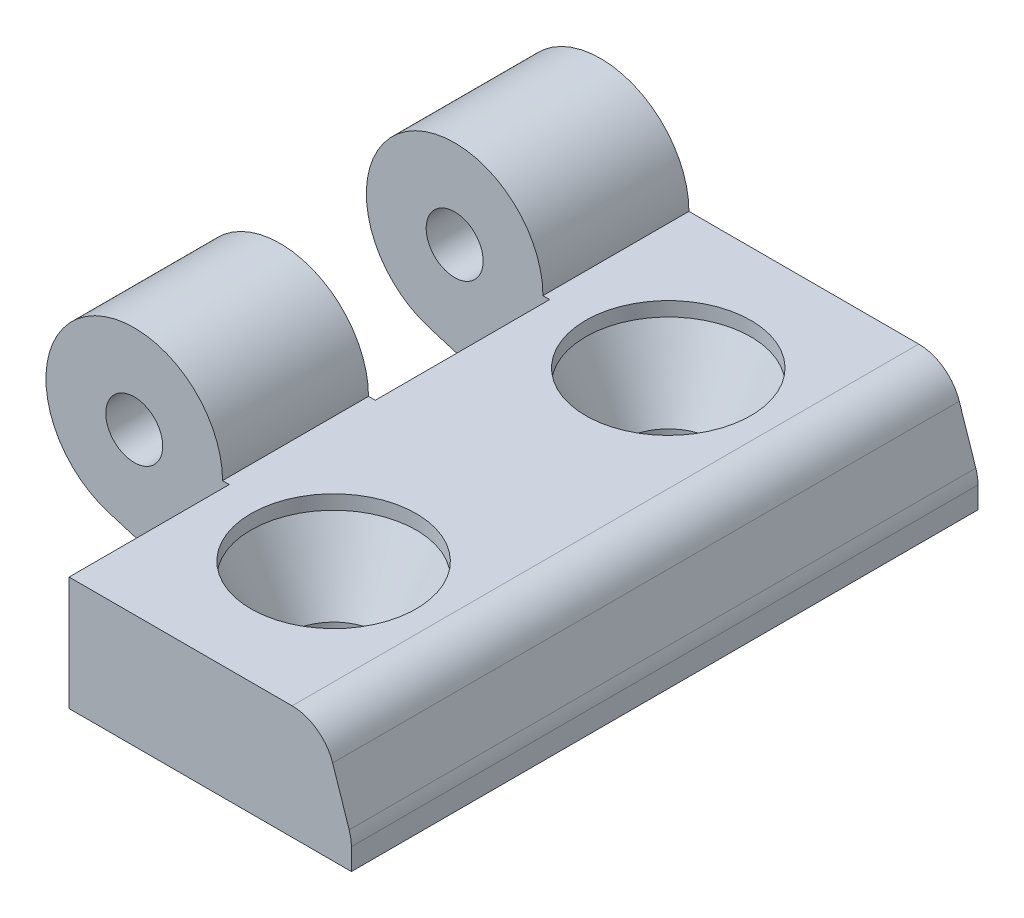
ISO-10303-21;
HEADER;
FILE_DESCRIPTION(('STEP AP214'),'2;1');
FILE_NAME('part.step','',(''),(''),'','','');
FILE_SCHEMA(('AUTOMOTIVE_DESIGN { 1 0 10303 214 1 1 1 1 }'));
ENDSEC;
DATA;
#1=APPLICATION_CONTEXT('core data for automotive mechanical design processes');
#2=APPLICATION_PROTOCOL_DEFINITION('international standard','automotive_design',2000,#1);
#3=PRODUCT_CONTEXT('',#1,'mechanical');
#4=PRODUCT('Part','Part','',(#3));
#5=PRODUCT_RELATED_PRODUCT_CATEGORY('part','',(#4));
#6=PRODUCT_DEFINITION_FORMATION('','',#4);
#7=PRODUCT_DEFINITION_CONTEXT('part definition',#1,'design');
#8=PRODUCT_DEFINITION('design','',#6,#7);
#9=PRODUCT_DEFINITION_SHAPE('','',#8);
#10=(LENGTH_UNIT() NAMED_UNIT(*) SI_UNIT(.MILLI.,.METRE.));
#11=(NAMED_UNIT(*) PLANE_ANGLE_UNIT() SI_UNIT($,.RADIAN.));
#12=(NAMED_UNIT(*) SI_UNIT($,.STERADIAN.) SOLID_ANGLE_UNIT());
#13=UNCERTAINTY_MEASURE_WITH_UNIT(LENGTH_MEASURE(1.E-05),#10,'distance_accuracy_value','');
#14=(GEOMETRIC_REPRESENTATION_CONTEXT(3) GLOBAL_UNCERTAINTY_ASSIGNED_CONTEXT((#13)) GLOBAL_UNIT_ASSIGNED_CONTEXT((#10,
#11,#12)) REPRESENTATION_CONTEXT('',''));
#15=CARTESIAN_POINT('',(0.,0.,0.));
#16=DIRECTION('',(0.,0.,1.));
#17=DIRECTION('',(1.,0.,0.));
#18=AXIS2_PLACEMENT_3D('',#15,#16,#17);
#19=CARTESIAN_POINT('',(5.00000000000045,-8.,22.));
#20=DIRECTION('',(0.,1.,0.));
#21=DIRECTION('',(0.,0.,1.));
#22=AXIS2_PLACEMENT_3D('',#19,#20,#21);
#23=PLANE('',#22);
#24=CARTESIAN_POINT('',(15.,-8.,-11.75));
#25=DIRECTION('',(0.,1.,0.));
#26=DIRECTION('',(-1.,0.,0.));
#27=AXIS2_PLACEMENT_3D('',#24,#25,#26);
#28=CIRCLE('',#27,3.25);
#29=CARTESIAN_POINT('',(11.75,-8.,-11.75));
#30=VERTEX_POINT('',#29);
#31=EDGE_CURVE('E331',#30,#30,#28,.T.);
#32=ORIENTED_EDGE('',*,*,#31,.T.);
#33=EDGE_LOOP('',(#32));
#34=FACE_BOUND('',#33,.T.);
#35=DIRECTION('',(0.,0.,-1.));
#36=VECTOR('',#35,1.);
#37=CARTESIAN_POINT('',(5.00000000000045,-8.,22.));
#38=LINE('',#37,#36);
#39=CARTESIAN_POINT('',(5.00000000000146,-8.00000000000031,10.75));
#40=VERTEX_POINT('',#39);
#41=CARTESIAN_POINT('',(5.00000000000146,-8.00000000000031,0.5));
#42=VERTEX_POINT('',#41);
#43=EDGE_CURVE('E231',#40,#42,#38,.T.);
#44=ORIENTED_EDGE('',*,*,#43,.T.);
#45=DIRECTION('',(1.,0.,0.));
#46=VECTOR('',#45,1.);
#47=CARTESIAN_POINT('',(6.67443888756299,-8.00000000000028,0.5));
#48=LINE('',#47,#46);
#49=CARTESIAN_POINT('',(6.67443888756299,-8.00000000000028,0.5));
#50=VERTEX_POINT('',#49);
#51=EDGE_CURVE('E151',#42,#50,#48,.T.);
#52=ORIENTED_EDGE('',*,*,#51,.T.);
#53=DIRECTION('',(0.,0.,-1.));
#54=VECTOR('',#53,1.);
#55=CARTESIAN_POINT('',(6.67443888756299,-8.00000000000028,0.5));
#56=LINE('',#55,#54);
#57=CARTESIAN_POINT('',(6.67443888756299,-8.00000000000028,-11.75));
#58=VERTEX_POINT('',#57);
#59=EDGE_CURVE('E147',#50,#58,#56,.T.);
#60=ORIENTED_EDGE('',*,*,#59,.T.);
#61=DIRECTION('',(-1.,0.,0.));
#62=VECTOR('',#61,1.);
#63=CARTESIAN_POINT('',(6.67443888756299,-8.00000000000028,-11.75));
#64=LINE('',#63,#62);
#65=CARTESIAN_POINT('',(5.00000000000146,-8.00000000000031,-11.75));
#66=VERTEX_POINT('',#65);
#67=EDGE_CURVE('E154',#58,#66,#64,.T.);
#68=ORIENTED_EDGE('',*,*,#67,.T.);
#69=CARTESIAN_POINT('',(5.00000000000045,-8.,-22.));
#70=VERTEX_POINT('',#69);
#71=EDGE_CURVE('E212',#66,#70,#38,.T.);
#72=ORIENTED_EDGE('',*,*,#71,.T.);
#73=DIRECTION('',(1.,0.,0.));
#74=VECTOR('',#73,1.);
#75=CARTESIAN_POINT('',(5.00000000000045,-8.,-22.));
#76=LINE('',#75,#74);
#77=CARTESIAN_POINT('',(26.5,-8.,-22.));
#78=VERTEX_POINT('',#77);
#79=EDGE_CURVE('E197',#70,#78,#76,.T.);
#80=ORIENTED_EDGE('',*,*,#79,.T.);
#81=DIRECTION('',(0.,0.,-1.));
#82=VECTOR('',#81,1.);
#83=CARTESIAN_POINT('',(26.5,-8.,22.));
#84=LINE('',#83,#82);
#85=CARTESIAN_POINT('',(26.5,-8.,22.));
#86=VERTEX_POINT('',#85);
#87=EDGE_CURVE('E253',#86,#78,#84,.T.);
#88=ORIENTED_EDGE('',*,*,#87,.F.);
#89=DIRECTION('',(1.,0.,0.));
#90=VECTOR('',#89,1.);
#91=CARTESIAN_POINT('',(5.00000000000045,-8.,22.));
#92=LINE('',#91,#90);
#93=CARTESIAN_POINT('',(6.67443888756299,-8.,22.));
#94=VERTEX_POINT('',#93);
#95=EDGE_CURVE('E198',#94,#86,#92,.T.);
#96=ORIENTED_EDGE('',*,*,#95,.F.);
#97=DIRECTION('',(0.,0.,-1.));
#98=VECTOR('',#97,1.);
#99=CARTESIAN_POINT('',(6.67443888756299,-8.00000000000028,22.));
#100=LINE('',#99,#98);
#101=CARTESIAN_POINT('',(6.67443888756299,-8.00000000000028,10.75));
#102=VERTEX_POINT('',#101);
#103=EDGE_CURVE('E58',#94,#102,#100,.T.);
#104=ORIENTED_EDGE('',*,*,#103,.T.);
#105=DIRECTION('',(-1.,0.,0.));
#106=VECTOR('',#105,1.);
#107=CARTESIAN_POINT('',(6.67443888756299,-8.00000000000028,10.75));
#108=LINE('',#107,#106);
#109=EDGE_CURVE('E180',#102,#40,#108,.T.);
#110=ORIENTED_EDGE('',*,*,#109,.T.);
#111=EDGE_LOOP('',(#44,#52,#60,#68,#72,#80,#88,#96,#104,#110));
#112=FACE_BOUND('',#111,.T.);
#113=CARTESIAN_POINT('',(15.,-8.,11.75));
#114=DIRECTION('',(0.,1.,0.));
#115=DIRECTION('',(-1.,0.,0.));
#116=AXIS2_PLACEMENT_3D('',#113,#114,#115);
#117=CIRCLE('',#116,3.25);
#118=CARTESIAN_POINT('',(11.75,-8.,11.75));
#119=VERTEX_POINT('',#118);
#120=EDGE_CURVE('E538',#119,#119,#117,.T.);
#121=ORIENTED_EDGE('',*,*,#120,.T.);
#122=EDGE_LOOP('',(#121));
#123=FACE_BOUND('',#122,.T.);
#124=ADVANCED_FACE('F35',(#34,#112,#123),#23,.F.);
#125=CARTESIAN_POINT('',(6.19999999999982,0.,22.));
#126=DIRECTION('',(0.,-1.,0.));
#127=DIRECTION('',(1.,0.,0.));
#128=AXIS2_PLACEMENT_3D('',#125,#126,#127);
#129=PLANE('',#128);
#130=CARTESIAN_POINT('',(15.,2.23866064574807E-13,-11.75));
#131=DIRECTION('',(0.,1.,0.));
#132=DIRECTION('',(-1.,0.,0.));
#133=AXIS2_PLACEMENT_3D('',#130,#131,#132);
#134=CIRCLE('',#133,5.8);
#135=CARTESIAN_POINT('',(9.2,2.26381413614973E-13,-11.75));
#136=VERTEX_POINT('',#135);
#137=EDGE_CURVE('E346',#136,#136,#134,.T.);
#138=ORIENTED_EDGE('',*,*,#137,.F.);
#139=EDGE_LOOP('',(#138));
#140=FACE_BOUND('',#139,.T.);
#141=DIRECTION('',(0.,0.,1.));
#142=VECTOR('',#141,1.);
#143=CARTESIAN_POINT('',(6.67443888756287,0.,22.));
#144=LINE('',#143,#142);
#145=CARTESIAN_POINT('',(6.67443888756287,0.,-11.75));
#146=VERTEX_POINT('',#145);
#147=CARTESIAN_POINT('',(6.67443888756287,0.,0.5));
#148=VERTEX_POINT('',#147);
#149=EDGE_CURVE('E11',#146,#148,#144,.T.);
#150=ORIENTED_EDGE('',*,*,#149,.T.);
#151=DIRECTION('',(-1.,0.,0.));
#152=VECTOR('',#151,1.);
#153=CARTESIAN_POINT('',(6.19999999999982,0.,0.5));
#154=LINE('',#153,#152);
#155=CARTESIAN_POINT('',(6.19999999999991,0.,0.5));
#156=VERTEX_POINT('',#155);
#157=EDGE_CURVE('E176',#148,#156,#154,.T.);
#158=ORIENTED_EDGE('',*,*,#157,.T.);
#159=DIRECTION('',(0.,0.,-1.));
#160=VECTOR('',#159,1.);
#161=CARTESIAN_POINT('',(6.19999999999982,0.,22.));
#162=LINE('',#161,#160);
#163=CARTESIAN_POINT('',(6.19999999999991,0.,10.75));
#164=VERTEX_POINT('',#163);
#165=EDGE_CURVE('E238',#164,#156,#162,.T.);
#166=ORIENTED_EDGE('',*,*,#165,.F.);
#167=DIRECTION('',(1.,0.,0.));
#168=VECTOR('',#167,1.);
#169=CARTESIAN_POINT('',(6.19999999999982,0.,10.75));
#170=LINE('',#169,#168);
#171=CARTESIAN_POINT('',(6.67443888756288,0.,10.75));
#172=VERTEX_POINT('',#171);
#173=EDGE_CURVE('E194',#164,#172,#170,.T.);
#174=ORIENTED_EDGE('',*,*,#173,.T.);
#175=DIRECTION('',(0.,0.,1.));
#176=VECTOR('',#175,1.);
#177=CARTESIAN_POINT('',(6.67443888756288,0.,22.));
#178=LINE('',#177,#176);
#179=CARTESIAN_POINT('',(6.67443888756288,1.14491749414469E-13,22.));
#180=VERTEX_POINT('',#179);
#181=EDGE_CURVE('E186',#172,#180,#178,.T.);
#182=ORIENTED_EDGE('',*,*,#181,.T.);
#183=DIRECTION('',(-1.,0.,0.));
#184=VECTOR('',#183,1.);
#185=CARTESIAN_POINT('',(6.19999999999982,0.,22.));
#186=LINE('',#185,#184);
#187=CARTESIAN_POINT('',(22.3377223398315,2.26381413614973E-13,22.));
#188=VERTEX_POINT('',#187);
#189=EDGE_CURVE('E209',#188,#180,#186,.T.);
#190=ORIENTED_EDGE('',*,*,#189,.F.);
#191=DIRECTION('',(0.,0.,-1.));
#192=VECTOR('',#191,1.);
#193=CARTESIAN_POINT('',(22.3377223398315,2.26381413614973E-13,22.));
#194=LINE('',#193,#192);
#195=CARTESIAN_POINT('',(22.3377223398315,2.26381413614973E-13,-22.));
#196=VERTEX_POINT('',#195);
#197=EDGE_CURVE('E241',#188,#196,#194,.T.);
#198=ORIENTED_EDGE('',*,*,#197,.T.);
#199=DIRECTION('',(-1.,0.,0.));
#200=VECTOR('',#199,1.);
#201=CARTESIAN_POINT('',(6.19999999999982,0.,-22.));
#202=LINE('',#201,#200);
#203=CARTESIAN_POINT('',(6.19999999999982,0.,-22.));
#204=VERTEX_POINT('',#203);
#205=EDGE_CURVE('E223',#196,#204,#202,.T.);
#206=ORIENTED_EDGE('',*,*,#205,.T.);
#207=CARTESIAN_POINT('',(6.19999999999991,0.,-11.75));
#208=VERTEX_POINT('',#207);
#209=EDGE_CURVE('E237',#208,#204,#162,.T.);
#210=ORIENTED_EDGE('',*,*,#209,.F.);
#211=DIRECTION('',(1.,0.,0.));
#212=VECTOR('',#211,1.);
#213=CARTESIAN_POINT('',(6.19999999999982,0.,-11.75));
#214=LINE('',#213,#212);
#215=EDGE_CURVE('E172',#208,#146,#214,.T.);
#216=ORIENTED_EDGE('',*,*,#215,.T.);
#217=EDGE_LOOP('',(#150,#158,#166,#174,#182,#190,#198,#206,#210,#216));
#218=FACE_BOUND('',#217,.T.);
#219=CARTESIAN_POINT('',(15.,2.23866064574807E-13,11.75));
#220=DIRECTION('',(0.,1.,0.));
#221=DIRECTION('',(-1.,0.,0.));
#222=AXIS2_PLACEMENT_3D('',#219,#220,#221);
#223=CIRCLE('',#222,5.8);
#224=CARTESIAN_POINT('',(9.2,2.26381413614973E-13,11.75));
#225=VERTEX_POINT('',#224);
#226=EDGE_CURVE('E334',#225,#225,#223,.T.);
#227=ORIENTED_EDGE('',*,*,#226,.F.);
#228=EDGE_LOOP('',(#227));
#229=FACE_BOUND('',#228,.T.);
#230=ADVANCED_FACE('F276',(#140,#218,#229),#129,.F.);
#231=CARTESIAN_POINT('',(0.,0.,22.));
#232=DIRECTION('',(0.,0.,-1.));
#233=DIRECTION('',(-1.,0.,0.));
#234=AXIS2_PLACEMENT_3D('',#231,#232,#233);
#235=CYLINDRICAL_SURFACE('',#234,6.19999999999991);
#236=DIRECTION('',(0.,0.,-1.));
#237=VECTOR('',#236,1.);
#238=CARTESIAN_POINT('',(-1.80318600538229,-5.93199125336445,22.));
#239=LINE('',#238,#237);
#240=CARTESIAN_POINT('',(-1.80318600538229,-5.93199125336445,-11.75));
#241=VERTEX_POINT('',#240);
#242=CARTESIAN_POINT('',(-1.80318600538229,-5.93199125336445,-22.));
#243=VERTEX_POINT('',#242);
#244=EDGE_CURVE('E233',#241,#243,#239,.T.);
#245=ORIENTED_EDGE('',*,*,#244,.F.);
#246=CARTESIAN_POINT('',(0.,0.,-11.75));
#247=DIRECTION('',(0.,0.,-1.));
#248=DIRECTION('',(-1.,0.,0.));
#249=AXIS2_PLACEMENT_3D('',#246,#247,#248);
#250=CIRCLE('',#249,6.19999999999991);
#251=EDGE_CURVE('E50',#241,#208,#250,.T.);
#252=ORIENTED_EDGE('',*,*,#251,.T.);
#253=ORIENTED_EDGE('',*,*,#209,.T.);
#254=CARTESIAN_POINT('',(0.,0.,-22.));
#255=DIRECTION('',(0.,0.,1.));
#256=DIRECTION('',(1.,0.,0.));
#257=AXIS2_PLACEMENT_3D('',#254,#255,#256);
#258=CIRCLE('',#257,6.19999999999991);
#259=EDGE_CURVE('E226',#204,#243,#258,.T.);
#260=ORIENTED_EDGE('',*,*,#259,.T.);
#261=EDGE_LOOP('',(#245,#252,#253,#260));
#262=FACE_BOUND('',#261,.T.);
#263=ADVANCED_FACE('F281',(#262),#235,.T.);
#264=CARTESIAN_POINT('',(5.00000000000045,-8.,22.));
#265=DIRECTION('',(0.290836452481103,0.956772782800706,0.));
#266=DIRECTION('',(-0.956772782800706,0.290836452481103,0.));
#267=AXIS2_PLACEMENT_3D('',#264,#265,#266);
#268=PLANE('',#267);
#269=CARTESIAN_POINT('',(-1.80318600538229,-5.93199125336455,10.75));
#270=VERTEX_POINT('',#269);
#271=CARTESIAN_POINT('',(-1.80318600538229,-5.93199125336455,0.500000000000001));
#272=VERTEX_POINT('',#271);
#273=EDGE_CURVE('E234',#270,#272,#239,.T.);
#274=ORIENTED_EDGE('',*,*,#273,.T.);
#275=DIRECTION('',(0.956772782800706,-0.290836452481103,0.));
#276=VECTOR('',#275,1.);
#277=CARTESIAN_POINT('',(5.00000000000045,-8.,0.5));
#278=LINE('',#277,#276);
#279=EDGE_CURVE('E43',#272,#42,#278,.T.);
#280=ORIENTED_EDGE('',*,*,#279,.T.);
#281=ORIENTED_EDGE('',*,*,#43,.F.);
#282=DIRECTION('',(-0.956772782800706,0.290836452481103,0.));
#283=VECTOR('',#282,1.);
#284=CARTESIAN_POINT('',(5.00000000000045,-8.,10.75));
#285=LINE('',#284,#283);
#286=EDGE_CURVE('E256',#40,#270,#285,.T.);
#287=ORIENTED_EDGE('',*,*,#286,.T.);
#288=EDGE_LOOP('',(#274,#280,#281,#287));
#289=FACE_BOUND('',#288,.T.);
#290=ADVANCED_FACE('F264',(#289),#268,.F.);
#291=CARTESIAN_POINT('',(26.5,-8.,22.));
#292=DIRECTION('',(-1.,0.,0.));
#293=DIRECTION('',(0.,0.,1.));
#294=AXIS2_PLACEMENT_3D('',#291,#292,#293);
#295=PLANE('',#294);
#296=DIRECTION('',(0.,1.,0.));
#297=VECTOR('',#296,1.);
#298=CARTESIAN_POINT('',(26.5,-8.,-22.));
#299=LINE('',#298,#297);
#300=CARTESIAN_POINT('',(26.5,-6.48683298050492,-22.));
#301=VERTEX_POINT('',#300);
#302=EDGE_CURVE('E215',#78,#301,#299,.T.);
#303=ORIENTED_EDGE('',*,*,#302,.T.);
#304=DIRECTION('',(0.,0.,-1.));
#305=VECTOR('',#304,1.);
#306=CARTESIAN_POINT('',(26.5,-6.48683298050492,22.));
#307=LINE('',#306,#305);
#308=CARTESIAN_POINT('',(26.5,-6.48683298050492,22.));
#309=VERTEX_POINT('',#308);
#310=EDGE_CURVE('E250',#309,#301,#307,.T.);
#311=ORIENTED_EDGE('',*,*,#310,.F.);
#312=DIRECTION('',(0.,1.,0.));
#313=VECTOR('',#312,1.);
#314=CARTESIAN_POINT('',(26.5,-8.,22.));
#315=LINE('',#314,#313);
#316=EDGE_CURVE('E200',#86,#309,#315,.T.);
#317=ORIENTED_EDGE('',*,*,#316,.F.);
#318=ORIENTED_EDGE('',*,*,#87,.T.);
#319=EDGE_LOOP('',(#303,#311,#317,#318));
#320=FACE_BOUND('',#319,.T.);
#321=ADVANCED_FACE('F295',(#320),#295,.F.);
#322=CARTESIAN_POINT('',(23.5,-6.48683298050492,22.));
#323=DIRECTION('',(0.,0.,-1.));
#324=DIRECTION('',(-1.,0.,0.));
#325=AXIS2_PLACEMENT_3D('',#322,#323,#324);
#326=CYLINDRICAL_SURFACE('',#325,3.00000000000007);
#327=CARTESIAN_POINT('',(23.5,-6.48683298050492,-22.));
#328=DIRECTION('',(0.,0.,1.));
#329=DIRECTION('',(1.,0.,0.));
#330=AXIS2_PLACEMENT_3D('',#327,#328,#329);
#331=CIRCLE('',#330,3.00000000000007);
#332=CARTESIAN_POINT('',(26.3460498941517,-5.53814968245458,-22.));
#333=VERTEX_POINT('',#332);
#334=EDGE_CURVE('E217',#301,#333,#331,.T.);
#335=ORIENTED_EDGE('',*,*,#334,.T.);
#336=DIRECTION('',(0.,0.,-1.));
#337=VECTOR('',#336,1.);
#338=CARTESIAN_POINT('',(26.3460498941517,-5.53814968245458,22.));
#339=LINE('',#338,#337);
#340=CARTESIAN_POINT('',(26.3460498941517,-5.53814968245458,22.));
#341=VERTEX_POINT('',#340);
#342=EDGE_CURVE('E247',#341,#333,#339,.T.);
#343=ORIENTED_EDGE('',*,*,#342,.F.);
#344=CARTESIAN_POINT('',(23.5,-6.48683298050492,22.));
#345=DIRECTION('',(0.,0.,1.));
#346=DIRECTION('',(1.,0.,0.));
#347=AXIS2_PLACEMENT_3D('',#344,#345,#346);
#348=CIRCLE('',#347,3.00000000000007);
#349=EDGE_CURVE('E203',#309,#341,#348,.T.);
#350=ORIENTED_EDGE('',*,*,#349,.F.);
#351=ORIENTED_EDGE('',*,*,#310,.T.);
#352=EDGE_LOOP('',(#335,#343,#350,#351));
#353=FACE_BOUND('',#352,.T.);
#354=ADVANCED_FACE('F313',(#353),#326,.T.);
#355=CARTESIAN_POINT('',(26.3460498941518,-5.53814968245456,22.));
#356=DIRECTION('',(-0.948683298050495,-0.316227766016894,0.));
#357=DIRECTION('',(0.316227766016894,-0.948683298050495,0.));
#358=AXIS2_PLACEMENT_3D('',#355,#356,#357);
#359=PLANE('',#358);
#360=DIRECTION('',(-0.316227766016894,0.948683298050495,0.));
#361=VECTOR('',#360,1.);
#362=CARTESIAN_POINT('',(26.3460498941518,-5.53814968245456,-22.));
#363=LINE('',#362,#361);
#364=CARTESIAN_POINT('',(25.183772233983,-2.05131670194905,-22.));
#365=VERTEX_POINT('',#364);
#366=EDGE_CURVE('E219',#333,#365,#363,.T.);
#367=ORIENTED_EDGE('',*,*,#366,.T.);
#368=DIRECTION('',(0.,0.,-1.));
#369=VECTOR('',#368,1.);
#370=CARTESIAN_POINT('',(25.183772233983,-2.05131670194905,22.));
#371=LINE('',#370,#369);
#372=CARTESIAN_POINT('',(25.183772233983,-2.05131670194905,22.));
#373=VERTEX_POINT('',#372);
#374=EDGE_CURVE('E244',#373,#365,#371,.T.);
#375=ORIENTED_EDGE('',*,*,#374,.F.);
#376=DIRECTION('',(-0.316227766016894,0.948683298050495,0.));
#377=VECTOR('',#376,1.);
#378=CARTESIAN_POINT('',(26.3460498941518,-5.53814968245456,22.));
#379=LINE('',#378,#377);
#380=EDGE_CURVE('E205',#341,#373,#379,.T.);
#381=ORIENTED_EDGE('',*,*,#380,.F.);
#382=ORIENTED_EDGE('',*,*,#342,.T.);
#383=EDGE_LOOP('',(#367,#375,#381,#382));
#384=FACE_BOUND('',#383,.T.);
#385=ADVANCED_FACE('F311',(#384),#359,.F.);
#386=CARTESIAN_POINT('',(22.3377223398315,-2.99999999999977,22.));
#387=DIRECTION('',(0.,0.,-1.));
#388=DIRECTION('',(-1.,0.,0.));
#389=AXIS2_PLACEMENT_3D('',#386,#387,#388);
#390=CYLINDRICAL_SURFACE('',#389,3.);
#391=CARTESIAN_POINT('',(22.3377223398315,-2.99999999999977,-22.));
#392=DIRECTION('',(0.,0.,1.));
#393=DIRECTION('',(1.,0.,0.));
#394=AXIS2_PLACEMENT_3D('',#391,#392,#393);
#395=CIRCLE('',#394,3.);
#396=EDGE_CURVE('E221',#365,#196,#395,.T.);
#397=ORIENTED_EDGE('',*,*,#396,.T.);
#398=ORIENTED_EDGE('',*,*,#197,.F.);
#399=CARTESIAN_POINT('',(22.3377223398315,-2.99999999999977,22.));
#400=DIRECTION('',(0.,0.,1.));
#401=DIRECTION('',(1.,0.,0.));
#402=AXIS2_PLACEMENT_3D('',#399,#400,#401);
#403=CIRCLE('',#402,3.);
#404=EDGE_CURVE('E207',#373,#188,#403,.T.);
#405=ORIENTED_EDGE('',*,*,#404,.F.);
#406=ORIENTED_EDGE('',*,*,#374,.T.);
#407=EDGE_LOOP('',(#397,#398,#405,#406));
#408=FACE_BOUND('',#407,.T.);
#409=ADVANCED_FACE('F307',(#408),#390,.T.);
#410=CARTESIAN_POINT('',(0.,0.,0.5));
#411=DIRECTION('',(0.,0.,1.));
#412=DIRECTION('',(1.,0.,0.));
#413=AXIS2_PLACEMENT_3D('',#410,#411,#412);
#414=CIRCLE('',#413,6.19999999999991);
#415=EDGE_CURVE('E174',#156,#272,#414,.T.);
#416=ORIENTED_EDGE('',*,*,#415,.T.);
#417=ORIENTED_EDGE('',*,*,#273,.F.);
#418=CARTESIAN_POINT('',(0.,0.,10.75));
#419=DIRECTION('',(0.,0.,-1.));
#420=DIRECTION('',(-1.,0.,0.));
#421=AXIS2_PLACEMENT_3D('',#418,#419,#420);
#422=CIRCLE('',#421,6.19999999999991);
#423=EDGE_CURVE('E191',#270,#164,#422,.T.);
#424=ORIENTED_EDGE('',*,*,#423,.T.);
#425=ORIENTED_EDGE('',*,*,#165,.T.);
#426=EDGE_LOOP('',(#416,#417,#424,#425));
#427=FACE_BOUND('',#426,.T.);
#428=ADVANCED_FACE('F272',(#427),#235,.T.);
#429=ORIENTED_EDGE('',*,*,#71,.F.);
#430=DIRECTION('',(-0.956772782800706,0.290836452481103,0.));
#431=VECTOR('',#430,1.);
#432=CARTESIAN_POINT('',(5.00000000000045,-8.,-11.75));
#433=LINE('',#432,#431);
#434=EDGE_CURVE('E156',#66,#241,#433,.T.);
#435=ORIENTED_EDGE('',*,*,#434,.T.);
#436=ORIENTED_EDGE('',*,*,#244,.T.);
#437=DIRECTION('',(0.956772782800706,-0.290836452481103,0.));
#438=VECTOR('',#437,1.);
#439=CARTESIAN_POINT('',(5.00000000000045,-8.,-22.));
#440=LINE('',#439,#438);
#441=EDGE_CURVE('E201',#243,#70,#440,.T.);
#442=ORIENTED_EDGE('',*,*,#441,.T.);
#443=EDGE_LOOP('',(#429,#435,#436,#442));
#444=FACE_BOUND('',#443,.T.);
#445=ADVANCED_FACE('F285',(#444),#268,.F.);
#446=CARTESIAN_POINT('',(23.5,-6.48683298050492,22.));
#447=DIRECTION('',(0.,0.,1.));
#448=DIRECTION('',(1.,0.,0.));
#449=AXIS2_PLACEMENT_3D('',#446,#447,#448);
#450=PLANE('',#449);
#451=DIRECTION('',(0.,1.,0.));
#452=VECTOR('',#451,1.);
#453=CARTESIAN_POINT('',(6.67443888756299,-8.00000000000028,22.));
#454=LINE('',#453,#452);
#455=EDGE_CURVE('E184',#94,#180,#454,.T.);
#456=ORIENTED_EDGE('',*,*,#455,.F.);
#457=ORIENTED_EDGE('',*,*,#95,.T.);
#458=ORIENTED_EDGE('',*,*,#316,.T.);
#459=ORIENTED_EDGE('',*,*,#349,.T.);
#460=ORIENTED_EDGE('',*,*,#380,.T.);
#461=ORIENTED_EDGE('',*,*,#404,.T.);
#462=ORIENTED_EDGE('',*,*,#189,.T.);
#463=EDGE_LOOP('',(#456,#457,#458,#459,#460,#461,#462));
#464=FACE_BOUND('',#463,.T.);
#465=ADVANCED_FACE('F298',(#464),#450,.T.);
#466=CARTESIAN_POINT('',(23.5,-6.48683298050492,-22.));
#467=DIRECTION('',(0.,0.,1.));
#468=DIRECTION('',(1.,0.,0.));
#469=AXIS2_PLACEMENT_3D('',#466,#467,#468);
#470=PLANE('',#469);
#471=CARTESIAN_POINT('',(0.,0.,-22.));
#472=DIRECTION('',(0.,0.,-1.));
#473=DIRECTION('',(-1.,0.,0.));
#474=AXIS2_PLACEMENT_3D('',#471,#472,#473);
#475=CIRCLE('',#474,2.);
#476=CARTESIAN_POINT('',(-2.,0.,-22.));
#477=VERTEX_POINT('',#476);
#478=EDGE_CURVE('E349',#477,#477,#475,.T.);
#479=ORIENTED_EDGE('',*,*,#478,.F.);
#480=EDGE_LOOP('',(#479));
#481=FACE_BOUND('',#480,.T.);
#482=ORIENTED_EDGE('',*,*,#79,.F.);
#483=ORIENTED_EDGE('',*,*,#441,.F.);
#484=ORIENTED_EDGE('',*,*,#259,.F.);
#485=ORIENTED_EDGE('',*,*,#205,.F.);
#486=ORIENTED_EDGE('',*,*,#396,.F.);
#487=ORIENTED_EDGE('',*,*,#366,.F.);
#488=ORIENTED_EDGE('',*,*,#334,.F.);
#489=ORIENTED_EDGE('',*,*,#302,.F.);
#490=EDGE_LOOP('',(#482,#483,#484,#485,#486,#487,#488,#489));
#491=FACE_BOUND('',#490,.T.);
#492=ADVANCED_FACE('F289',(#481,#491),#470,.F.);
#493=CARTESIAN_POINT('',(6.67443888756299,-8.00000000000028,10.75));
#494=DIRECTION('',(0.,0.,-1.));
#495=DIRECTION('',(-1.,0.,0.));
#496=AXIS2_PLACEMENT_3D('',#493,#494,#495);
#497=PLANE('',#496);
#498=CARTESIAN_POINT('',(0.,0.,10.75));
#499=DIRECTION('',(0.,0.,-1.));
#500=DIRECTION('',(-1.,0.,0.));
#501=AXIS2_PLACEMENT_3D('',#498,#499,#500);
#502=CIRCLE('',#501,2.);
#503=CARTESIAN_POINT('',(-2.,0.,10.75));
#504=VERTEX_POINT('',#503);
#505=EDGE_CURVE('E162',#504,#504,#502,.T.);
#506=ORIENTED_EDGE('',*,*,#505,.T.);
#507=EDGE_LOOP('',(#506));
#508=FACE_BOUND('',#507,.T.);
#509=ORIENTED_EDGE('',*,*,#423,.F.);
#510=ORIENTED_EDGE('',*,*,#286,.F.);
#511=ORIENTED_EDGE('',*,*,#109,.F.);
#512=DIRECTION('',(0.,1.,0.));
#513=VECTOR('',#512,1.);
#514=CARTESIAN_POINT('',(6.67443888756299,-8.00000000000028,10.75));
#515=LINE('',#514,#513);
#516=EDGE_CURVE('E183',#102,#172,#515,.T.);
#517=ORIENTED_EDGE('',*,*,#516,.T.);
#518=ORIENTED_EDGE('',*,*,#173,.F.);
#519=EDGE_LOOP('',(#509,#510,#511,#517,#518));
#520=FACE_BOUND('',#519,.T.);
#521=ADVANCED_FACE('F270',(#508,#520),#497,.F.);
#522=CARTESIAN_POINT('',(6.67443888756299,-8.00000000000028,22.));
#523=DIRECTION('',(1.,0.,0.));
#524=DIRECTION('',(0.,1.,0.));
#525=AXIS2_PLACEMENT_3D('',#522,#523,#524);
#526=PLANE('',#525);
#527=ORIENTED_EDGE('',*,*,#516,.F.);
#528=ORIENTED_EDGE('',*,*,#103,.F.);
#529=ORIENTED_EDGE('',*,*,#455,.T.);
#530=ORIENTED_EDGE('',*,*,#181,.F.);
#531=EDGE_LOOP('',(#527,#528,#529,#530));
#532=FACE_BOUND('',#531,.T.);
#533=ADVANCED_FACE('F301',(#532),#526,.F.);
#534=CARTESIAN_POINT('',(6.67443888756299,-8.00000000000028,0.5));
#535=DIRECTION('',(1.,0.,0.));
#536=DIRECTION('',(0.,1.,0.));
#537=AXIS2_PLACEMENT_3D('',#534,#535,#536);
#538=PLANE('',#537);
#539=DIRECTION('',(0.,1.,0.));
#540=VECTOR('',#539,1.);
#541=CARTESIAN_POINT('',(6.67443888756299,-8.00000000000028,-11.75));
#542=LINE('',#541,#540);
#543=EDGE_CURVE('E142',#58,#146,#542,.T.);
#544=ORIENTED_EDGE('',*,*,#543,.F.);
#545=ORIENTED_EDGE('',*,*,#59,.F.);
#546=DIRECTION('',(0.,1.,0.));
#547=VECTOR('',#546,1.);
#548=CARTESIAN_POINT('',(6.67443888756299,-8.00000000000028,0.5));
#549=LINE('',#548,#547);
#550=EDGE_CURVE('E150',#50,#148,#549,.T.);
#551=ORIENTED_EDGE('',*,*,#550,.T.);
#552=ORIENTED_EDGE('',*,*,#149,.F.);
#553=EDGE_LOOP('',(#544,#545,#551,#552));
#554=FACE_BOUND('',#553,.T.);
#555=ADVANCED_FACE('F144',(#554),#538,.F.);
#556=CARTESIAN_POINT('',(6.67443888756299,-8.00000000000028,0.5));
#557=DIRECTION('',(0.,0.,1.));
#558=DIRECTION('',(1.,0.,0.));
#559=AXIS2_PLACEMENT_3D('',#556,#557,#558);
#560=PLANE('',#559);
#561=CARTESIAN_POINT('',(0.,0.,0.5));
#562=DIRECTION('',(0.,0.,1.));
#563=DIRECTION('',(1.,0.,0.));
#564=AXIS2_PLACEMENT_3D('',#561,#562,#563);
#565=CIRCLE('',#564,2.);
#566=CARTESIAN_POINT('',(2.,0.,0.5));
#567=VERTEX_POINT('',#566);
#568=EDGE_CURVE('E165',#567,#567,#565,.T.);
#569=ORIENTED_EDGE('',*,*,#568,.T.);
#570=EDGE_LOOP('',(#569));
#571=FACE_BOUND('',#570,.T.);
#572=ORIENTED_EDGE('',*,*,#550,.F.);
#573=ORIENTED_EDGE('',*,*,#51,.F.);
#574=ORIENTED_EDGE('',*,*,#279,.F.);
#575=ORIENTED_EDGE('',*,*,#415,.F.);
#576=ORIENTED_EDGE('',*,*,#157,.F.);
#577=EDGE_LOOP('',(#572,#573,#574,#575,#576));
#578=FACE_BOUND('',#577,.T.);
#579=ADVANCED_FACE('F274',(#571,#578),#560,.F.);
#580=CARTESIAN_POINT('',(6.67443888756299,-8.00000000000028,-11.75));
#581=DIRECTION('',(0.,0.,-1.));
#582=DIRECTION('',(-1.,0.,0.));
#583=AXIS2_PLACEMENT_3D('',#580,#581,#582);
#584=PLANE('',#583);
#585=CARTESIAN_POINT('',(0.,0.,-11.75));
#586=DIRECTION('',(0.,0.,-1.));
#587=DIRECTION('',(-1.,0.,0.));
#588=AXIS2_PLACEMENT_3D('',#585,#586,#587);
#589=CIRCLE('',#588,2.);
#590=CARTESIAN_POINT('',(-2.,0.,-11.75));
#591=VERTEX_POINT('',#590);
#592=EDGE_CURVE('E38',#591,#591,#589,.T.);
#593=ORIENTED_EDGE('',*,*,#592,.T.);
#594=EDGE_LOOP('',(#593));
#595=FACE_BOUND('',#594,.T.);
#596=ORIENTED_EDGE('',*,*,#251,.F.);
#597=ORIENTED_EDGE('',*,*,#434,.F.);
#598=ORIENTED_EDGE('',*,*,#67,.F.);
#599=ORIENTED_EDGE('',*,*,#543,.T.);
#600=ORIENTED_EDGE('',*,*,#215,.F.);
#601=EDGE_LOOP('',(#596,#597,#598,#599,#600));
#602=FACE_BOUND('',#601,.T.);
#603=ADVANCED_FACE('F155',(#595,#602),#584,.F.);
#604=CARTESIAN_POINT('',(0.,0.,22.));
#605=DIRECTION('',(0.,0.,-1.));
#606=DIRECTION('',(-1.,0.,0.));
#607=AXIS2_PLACEMENT_3D('',#604,#605,#606);
#608=CYLINDRICAL_SURFACE('',#607,2.);
#609=ORIENTED_EDGE('',*,*,#478,.T.);
#610=EDGE_LOOP('',(#609));
#611=FACE_BOUND('',#610,.T.);
#612=ORIENTED_EDGE('',*,*,#592,.F.);
#613=EDGE_LOOP('',(#612));
#614=FACE_BOUND('',#613,.T.);
#615=ADVANCED_FACE('F358',(#611,#614),#608,.F.);
#616=ORIENTED_EDGE('',*,*,#568,.F.);
#617=EDGE_LOOP('',(#616));
#618=FACE_BOUND('',#617,.T.);
#619=ORIENTED_EDGE('',*,*,#505,.F.);
#620=EDGE_LOOP('',(#619));
#621=FACE_BOUND('',#620,.T.);
#622=ADVANCED_FACE('F360',(#618,#621),#608,.F.);
#623=CARTESIAN_POINT('',(15.,2.26381413614973E-13,-11.75));
#624=DIRECTION('',(0.,1.,0.));
#625=DIRECTION('',(-1.,0.,0.));
#626=AXIS2_PLACEMENT_3D('',#623,#624,#625);
#627=CYLINDRICAL_SURFACE('',#626,5.8);
#628=ORIENTED_EDGE('',*,*,#137,.T.);
#629=EDGE_LOOP('',(#628));
#630=FACE_BOUND('',#629,.T.);
#631=CARTESIAN_POINT('',(15.,-0.999999999999776,-11.75));
#632=DIRECTION('',(0.,1.,0.));
#633=DIRECTION('',(-1.,0.,0.));
#634=AXIS2_PLACEMENT_3D('',#631,#632,#633);
#635=CIRCLE('',#634,5.8);
#636=CARTESIAN_POINT('',(9.2,-0.999999999999774,-11.75));
#637=VERTEX_POINT('',#636);
#638=EDGE_CURVE('E337',#637,#637,#635,.T.);
#639=ORIENTED_EDGE('',*,*,#638,.F.);
#640=EDGE_LOOP('',(#639));
#641=FACE_BOUND('',#640,.T.);
#642=ADVANCED_FACE('F367',(#630,#641),#627,.F.);
#643=CARTESIAN_POINT('',(15.,-6.,-11.75));
#644=DIRECTION('',(0.,1.,0.));
#645=DIRECTION('',(-1.,0.,0.));
#646=AXIS2_PLACEMENT_3D('',#643,#644,#645);
#647=CONICAL_SURFACE('',#646,3.25,0.47161556786231);
#648=ORIENTED_EDGE('',*,*,#638,.T.);
#649=EDGE_LOOP('',(#648));
#650=FACE_BOUND('',#649,.T.);
#651=CARTESIAN_POINT('',(15.,-6.,-11.75));
#652=DIRECTION('',(0.,1.,0.));
#653=DIRECTION('',(-1.,0.,0.));
#654=AXIS2_PLACEMENT_3D('',#651,#652,#653);
#655=CIRCLE('',#654,3.25);
#656=CARTESIAN_POINT('',(11.75,-6.,-11.75));
#657=VERTEX_POINT('',#656);
#658=EDGE_CURVE('E333',#657,#657,#655,.T.);
#659=ORIENTED_EDGE('',*,*,#658,.F.);
#660=EDGE_LOOP('',(#659));
#661=FACE_BOUND('',#660,.T.);
#662=ADVANCED_FACE('F484',(#650,#661),#647,.F.);
#663=CARTESIAN_POINT('',(15.,2.26381413614973E-13,-11.75));
#664=DIRECTION('',(0.,1.,0.));
#665=DIRECTION('',(-1.,0.,0.));
#666=AXIS2_PLACEMENT_3D('',#663,#664,#665);
#667=CYLINDRICAL_SURFACE('',#666,3.25);
#668=ORIENTED_EDGE('',*,*,#658,.T.);
#669=EDGE_LOOP('',(#668));
#670=FACE_BOUND('',#669,.T.);
#671=ORIENTED_EDGE('',*,*,#31,.F.);
#672=EDGE_LOOP('',(#671));
#673=FACE_BOUND('',#672,.T.);
#674=ADVANCED_FACE('F492',(#670,#673),#667,.F.);
#675=CARTESIAN_POINT('',(15.,2.26381413614973E-13,11.75));
#676=DIRECTION('',(0.,1.,0.));
#677=DIRECTION('',(-1.,0.,0.));
#678=AXIS2_PLACEMENT_3D('',#675,#676,#677);
#679=CYLINDRICAL_SURFACE('',#678,5.8);
#680=ORIENTED_EDGE('',*,*,#226,.T.);
#681=EDGE_LOOP('',(#680));
#682=FACE_BOUND('',#681,.T.);
#683=CARTESIAN_POINT('',(15.,-0.999999999999776,11.75));
#684=DIRECTION('',(0.,1.,0.));
#685=DIRECTION('',(-1.,0.,0.));
#686=AXIS2_PLACEMENT_3D('',#683,#684,#685);
#687=CIRCLE('',#686,5.8);
#688=CARTESIAN_POINT('',(9.2,-0.999999999999774,11.75));
#689=VERTEX_POINT('',#688);
#690=EDGE_CURVE('E340',#689,#689,#687,.T.);
#691=ORIENTED_EDGE('',*,*,#690,.F.);
#692=EDGE_LOOP('',(#691));
#693=FACE_BOUND('',#692,.T.);
#694=ADVANCED_FACE('F499',(#682,#693),#679,.F.);
#695=CARTESIAN_POINT('',(15.,-6.,11.75));
#696=DIRECTION('',(0.,1.,0.));
#697=DIRECTION('',(-1.,0.,0.));
#698=AXIS2_PLACEMENT_3D('',#695,#696,#697);
#699=CONICAL_SURFACE('',#698,3.25,0.47161556786231);
#700=ORIENTED_EDGE('',*,*,#690,.T.);
#701=EDGE_LOOP('',(#700));
#702=FACE_BOUND('',#701,.T.);
#703=CARTESIAN_POINT('',(15.,-6.,11.75));
#704=DIRECTION('',(0.,1.,0.));
#705=DIRECTION('',(-1.,0.,0.));
#706=AXIS2_PLACEMENT_3D('',#703,#704,#705);
#707=CIRCLE('',#706,3.25);
#708=CARTESIAN_POINT('',(11.75,-6.,11.75));
#709=VERTEX_POINT('',#708);
#710=EDGE_CURVE('E535',#709,#709,#707,.T.);
#711=ORIENTED_EDGE('',*,*,#710,.F.);
#712=EDGE_LOOP('',(#711));
#713=FACE_BOUND('',#712,.T.);
#714=ADVANCED_FACE('F508',(#702,#713),#699,.F.);
#715=CARTESIAN_POINT('',(15.,2.26381413614973E-13,11.75));
#716=DIRECTION('',(0.,1.,0.));
#717=DIRECTION('',(-1.,0.,0.));
#718=AXIS2_PLACEMENT_3D('',#715,#716,#717);
#719=CYLINDRICAL_SURFACE('',#718,3.25);
#720=ORIENTED_EDGE('',*,*,#710,.T.);
#721=EDGE_LOOP('',(#720));
#722=FACE_BOUND('',#721,.T.);
#723=ORIENTED_EDGE('',*,*,#120,.F.);
#724=EDGE_LOOP('',(#723));
#725=FACE_BOUND('',#724,.T.);
#726=ADVANCED_FACE('F515',(#722,#725),#719,.F.);
#727=CLOSED_SHELL('',(#124,#230,#263,#290,#321,#354,#385,#409,#428,#445,#465,#492,#521,#533,
#555,#579,#603,#615,#622,#642,#662,#674,#694,#714,#726));
#728=MANIFOLD_SOLID_BREP('B2',#727);
#729=ADVANCED_BREP_SHAPE_REPRESENTATION('',(#18,#728),#14);
#730=SHAPE_DEFINITION_REPRESENTATION(#9,#729);
ENDSEC;
END-ISO-10303-21;
